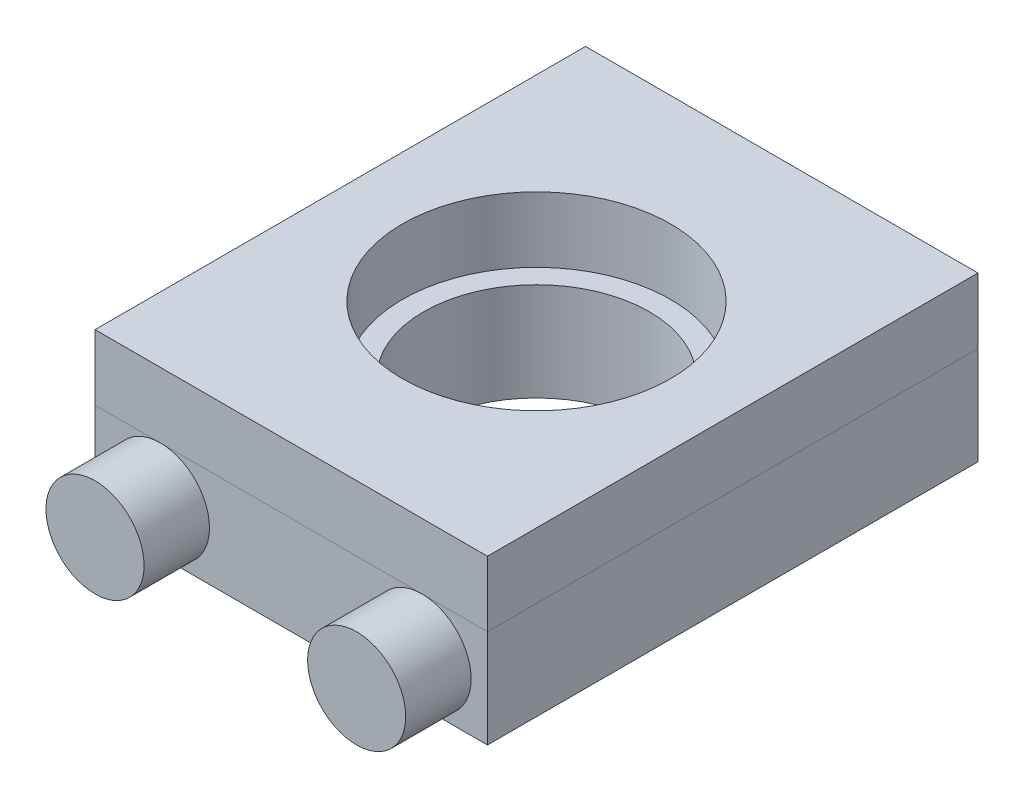
ISO-10303-21;
HEADER;
FILE_DESCRIPTION(('STEP AP214'),'2;1');
FILE_NAME('part.step','',(''),(''),'','','');
FILE_SCHEMA(('AUTOMOTIVE_DESIGN { 1 0 10303 214 1 1 1 1 }'));
ENDSEC;
DATA;
#1=APPLICATION_CONTEXT('core data for automotive mechanical design processes');
#2=APPLICATION_PROTOCOL_DEFINITION('international standard','automotive_design',2000,#1);
#3=PRODUCT_CONTEXT('',#1,'mechanical');
#4=PRODUCT('Part','Part','',(#3));
#5=PRODUCT_RELATED_PRODUCT_CATEGORY('part','',(#4));
#6=PRODUCT_DEFINITION_FORMATION('','',#4);
#7=PRODUCT_DEFINITION_CONTEXT('part definition',#1,'design');
#8=PRODUCT_DEFINITION('design','',#6,#7);
#9=PRODUCT_DEFINITION_SHAPE('','',#8);
#10=(LENGTH_UNIT() NAMED_UNIT(*) SI_UNIT(.MILLI.,.METRE.));
#11=(NAMED_UNIT(*) PLANE_ANGLE_UNIT() SI_UNIT($,.RADIAN.));
#12=(NAMED_UNIT(*) SI_UNIT($,.STERADIAN.) SOLID_ANGLE_UNIT());
#13=UNCERTAINTY_MEASURE_WITH_UNIT(LENGTH_MEASURE(1.E-05),#10,'distance_accuracy_value','');
#14=(GEOMETRIC_REPRESENTATION_CONTEXT(3) GLOBAL_UNCERTAINTY_ASSIGNED_CONTEXT((#13)) GLOBAL_UNIT_ASSIGNED_CONTEXT((#10,
#11,#12)) REPRESENTATION_CONTEXT('',''));
#15=CARTESIAN_POINT('',(0.,0.,0.));
#16=DIRECTION('',(0.,0.,1.));
#17=DIRECTION('',(1.,0.,0.));
#18=AXIS2_PLACEMENT_3D('',#15,#16,#17);
#19=CARTESIAN_POINT('',(12.,5.,0.));
#20=DIRECTION('',(-1.,0.,0.));
#21=DIRECTION('',(0.,0.,1.));
#22=AXIS2_PLACEMENT_3D('',#19,#20,#21);
#23=PLANE('',#22);
#24=DIRECTION('',(0.,0.,-1.));
#25=VECTOR('',#24,1.);
#26=CARTESIAN_POINT('',(12.,3.,0.));
#27=LINE('',#26,#25);
#28=CARTESIAN_POINT('',(12.,3.,0.));
#29=VERTEX_POINT('',#28);
#30=CARTESIAN_POINT('',(12.,3.,-15.));
#31=VERTEX_POINT('',#30);
#32=EDGE_CURVE('E139',#29,#31,#27,.T.);
#33=ORIENTED_EDGE('',*,*,#32,.T.);
#34=DIRECTION('',(0.,-1.,0.));
#35=VECTOR('',#34,1.);
#36=CARTESIAN_POINT('',(12.,5.,-15.));
#37=LINE('',#36,#35);
#38=CARTESIAN_POINT('',(12.,5.,-15.));
#39=VERTEX_POINT('',#38);
#40=EDGE_CURVE('E13',#39,#31,#37,.T.);
#41=ORIENTED_EDGE('',*,*,#40,.F.);
#42=DIRECTION('',(0.,0.,-1.));
#43=VECTOR('',#42,1.);
#44=CARTESIAN_POINT('',(12.,5.,0.));
#45=LINE('',#44,#43);
#46=CARTESIAN_POINT('',(12.,5.,0.));
#47=VERTEX_POINT('',#46);
#48=EDGE_CURVE('E124',#47,#39,#45,.T.);
#49=ORIENTED_EDGE('',*,*,#48,.F.);
#50=DIRECTION('',(0.,-1.,0.));
#51=VECTOR('',#50,1.);
#52=CARTESIAN_POINT('',(12.,5.,0.));
#53=LINE('',#52,#51);
#54=EDGE_CURVE('E132',#47,#29,#53,.T.);
#55=ORIENTED_EDGE('',*,*,#54,.T.);
#56=EDGE_LOOP('',(#33,#41,#49,#55));
#57=FACE_BOUND('',#56,.T.);
#58=ADVANCED_FACE('F72',(#57),#23,.F.);
#59=CARTESIAN_POINT('',(0.,5.,-15.));
#60=DIRECTION('',(0.,0.,1.));
#61=DIRECTION('',(1.,0.,0.));
#62=AXIS2_PLACEMENT_3D('',#59,#60,#61);
#63=PLANE('',#62);
#64=DIRECTION('',(-1.,0.,0.));
#65=VECTOR('',#64,1.);
#66=CARTESIAN_POINT('',(0.,3.,-15.));
#67=LINE('',#66,#65);
#68=CARTESIAN_POINT('',(0.,3.,-15.));
#69=VERTEX_POINT('',#68);
#70=EDGE_CURVE('E128',#31,#69,#67,.T.);
#71=ORIENTED_EDGE('',*,*,#70,.T.);
#72=DIRECTION('',(0.,-1.,0.));
#73=VECTOR('',#72,1.);
#74=CARTESIAN_POINT('',(0.,5.,-15.));
#75=LINE('',#74,#73);
#76=CARTESIAN_POINT('',(0.,5.,-15.));
#77=VERTEX_POINT('',#76);
#78=EDGE_CURVE('E81',#77,#69,#75,.T.);
#79=ORIENTED_EDGE('',*,*,#78,.F.);
#80=DIRECTION('',(-1.,0.,0.));
#81=VECTOR('',#80,1.);
#82=CARTESIAN_POINT('',(0.,5.,-15.));
#83=LINE('',#82,#81);
#84=EDGE_CURVE('E119',#39,#77,#83,.T.);
#85=ORIENTED_EDGE('',*,*,#84,.F.);
#86=ORIENTED_EDGE('',*,*,#40,.T.);
#87=EDGE_LOOP('',(#71,#79,#85,#86));
#88=FACE_BOUND('',#87,.T.);
#89=ADVANCED_FACE('F127',(#88),#63,.F.);
#90=CARTESIAN_POINT('',(0.,5.,0.));
#91=DIRECTION('',(1.,0.,0.));
#92=DIRECTION('',(0.,0.,-1.));
#93=AXIS2_PLACEMENT_3D('',#90,#91,#92);
#94=PLANE('',#93);
#95=DIRECTION('',(0.,0.,1.));
#96=VECTOR('',#95,1.);
#97=CARTESIAN_POINT('',(0.,3.,0.));
#98=LINE('',#97,#96);
#99=CARTESIAN_POINT('',(0.,3.,0.));
#100=VERTEX_POINT('',#99);
#101=EDGE_CURVE('E106',#69,#100,#98,.T.);
#102=ORIENTED_EDGE('',*,*,#101,.T.);
#103=DIRECTION('',(0.,-1.,0.));
#104=VECTOR('',#103,1.);
#105=CARTESIAN_POINT('',(0.,5.,0.));
#106=LINE('',#105,#104);
#107=CARTESIAN_POINT('',(0.,5.,0.));
#108=VERTEX_POINT('',#107);
#109=EDGE_CURVE('E129',#108,#100,#106,.T.);
#110=ORIENTED_EDGE('',*,*,#109,.F.);
#111=DIRECTION('',(0.,0.,1.));
#112=VECTOR('',#111,1.);
#113=CARTESIAN_POINT('',(0.,5.,0.));
#114=LINE('',#113,#112);
#115=EDGE_CURVE('E122',#77,#108,#114,.T.);
#116=ORIENTED_EDGE('',*,*,#115,.F.);
#117=ORIENTED_EDGE('',*,*,#78,.T.);
#118=EDGE_LOOP('',(#102,#110,#116,#117));
#119=FACE_BOUND('',#118,.T.);
#120=ADVANCED_FACE('F130',(#119),#94,.F.);
#121=CARTESIAN_POINT('',(6.,5.,-7.5));
#122=DIRECTION('',(0.,-1.,0.));
#123=DIRECTION('',(0.,0.,-1.));
#124=AXIS2_PLACEMENT_3D('',#121,#122,#123);
#125=CYLINDRICAL_SURFACE('',#124,4.1);
#126=CARTESIAN_POINT('',(6.,5.,-7.5));
#127=DIRECTION('',(0.,1.,0.));
#128=DIRECTION('',(0.,0.,1.));
#129=AXIS2_PLACEMENT_3D('',#126,#127,#128);
#130=CIRCLE('',#129,4.1);
#131=CARTESIAN_POINT('',(6.,5.,-3.4));
#132=VERTEX_POINT('',#131);
#133=EDGE_CURVE('E145',#132,#132,#130,.T.);
#134=ORIENTED_EDGE('',*,*,#133,.T.);
#135=EDGE_LOOP('',(#134));
#136=FACE_BOUND('',#135,.T.);
#137=CARTESIAN_POINT('',(6.,3.,-7.5));
#138=DIRECTION('',(0.,1.,0.));
#139=DIRECTION('',(0.,0.,1.));
#140=AXIS2_PLACEMENT_3D('',#137,#138,#139);
#141=CIRCLE('',#140,4.1);
#142=CARTESIAN_POINT('',(6.,3.,-3.4));
#143=VERTEX_POINT('',#142);
#144=EDGE_CURVE('E136',#143,#143,#141,.T.);
#145=ORIENTED_EDGE('',*,*,#144,.F.);
#146=EDGE_LOOP('',(#145));
#147=FACE_BOUND('',#146,.T.);
#148=ADVANCED_FACE('F74',(#136,#147),#125,.F.);
#149=CARTESIAN_POINT('',(0.,5.,0.));
#150=DIRECTION('',(0.,0.,-1.));
#151=DIRECTION('',(-1.,0.,0.));
#152=AXIS2_PLACEMENT_3D('',#149,#150,#151);
#153=PLANE('',#152);
#154=DIRECTION('',(1.,0.,0.));
#155=VECTOR('',#154,1.);
#156=CARTESIAN_POINT('',(0.,3.,0.));
#157=LINE('',#156,#155);
#158=EDGE_CURVE('E112',#100,#29,#157,.T.);
#159=ORIENTED_EDGE('',*,*,#158,.T.);
#160=ORIENTED_EDGE('',*,*,#54,.F.);
#161=DIRECTION('',(1.,0.,0.));
#162=VECTOR('',#161,1.);
#163=CARTESIAN_POINT('',(0.,5.,0.));
#164=LINE('',#163,#162);
#165=EDGE_CURVE('E89',#108,#47,#164,.T.);
#166=ORIENTED_EDGE('',*,*,#165,.F.);
#167=ORIENTED_EDGE('',*,*,#109,.T.);
#168=EDGE_LOOP('',(#159,#160,#166,#167));
#169=FACE_BOUND('',#168,.T.);
#170=ADVANCED_FACE('F147',(#169),#153,.F.);
#171=CARTESIAN_POINT('',(0.,5.,0.));
#172=DIRECTION('',(0.,1.,0.));
#173=DIRECTION('',(0.,0.,1.));
#174=AXIS2_PLACEMENT_3D('',#171,#172,#173);
#175=PLANE('',#174);
#176=ORIENTED_EDGE('',*,*,#133,.F.);
#177=EDGE_LOOP('',(#176));
#178=FACE_BOUND('',#177,.T.);
#179=ORIENTED_EDGE('',*,*,#48,.T.);
#180=ORIENTED_EDGE('',*,*,#84,.T.);
#181=ORIENTED_EDGE('',*,*,#115,.T.);
#182=ORIENTED_EDGE('',*,*,#165,.T.);
#183=EDGE_LOOP('',(#179,#180,#181,#182));
#184=FACE_BOUND('',#183,.T.);
#185=ADVANCED_FACE('F120',(#178,#184),#175,.T.);
#186=CARTESIAN_POINT('',(0.,3.,0.));
#187=DIRECTION('',(0.,1.,0.));
#188=DIRECTION('',(0.,0.,1.));
#189=AXIS2_PLACEMENT_3D('',#186,#187,#188);
#190=PLANE('',#189);
#191=ORIENTED_EDGE('',*,*,#144,.T.);
#192=EDGE_LOOP('',(#191));
#193=FACE_BOUND('',#192,.T.);
#194=ORIENTED_EDGE('',*,*,#32,.F.);
#195=ORIENTED_EDGE('',*,*,#158,.F.);
#196=ORIENTED_EDGE('',*,*,#101,.F.);
#197=ORIENTED_EDGE('',*,*,#70,.F.);
#198=EDGE_LOOP('',(#194,#195,#196,#197));
#199=FACE_BOUND('',#198,.T.);
#200=ADVANCED_FACE('F150',(#193,#199),#190,.F.);
#201=CLOSED_SHELL('',(#58,#89,#120,#148,#170,#185,#200));
#202=MANIFOLD_SOLID_BREP('B2',#201);
#203=CARTESIAN_POINT('',(0.,3.,0.));
#204=DIRECTION('',(0.,0.,-1.));
#205=DIRECTION('',(-1.,0.,0.));
#206=AXIS2_PLACEMENT_3D('',#203,#204,#205);
#207=PLANE('',#206);
#208=CARTESIAN_POINT('',(2.,1.5,0.));
#209=DIRECTION('',(0.,0.,1.));
#210=DIRECTION('',(1.,0.,0.));
#211=AXIS2_PLACEMENT_3D('',#208,#209,#210);
#212=CIRCLE('',#211,1.5);
#213=CARTESIAN_POINT('',(2.,3.,0.));
#214=VERTEX_POINT('',#213);
#215=CARTESIAN_POINT('',(2.,0.,0.));
#216=VERTEX_POINT('',#215);
#217=EDGE_CURVE('E241',#214,#216,#212,.T.);
#218=ORIENTED_EDGE('',*,*,#217,.F.);
#219=DIRECTION('',(1.,0.,0.));
#220=VECTOR('',#219,1.);
#221=CARTESIAN_POINT('',(0.,3.,0.));
#222=LINE('',#221,#220);
#223=CARTESIAN_POINT('',(0.,3.,0.));
#224=VERTEX_POINT('',#223);
#225=EDGE_CURVE('E339',#224,#214,#222,.T.);
#226=ORIENTED_EDGE('',*,*,#225,.F.);
#227=DIRECTION('',(0.,-1.,0.));
#228=VECTOR('',#227,1.);
#229=CARTESIAN_POINT('',(0.,3.,0.));
#230=LINE('',#229,#228);
#231=CARTESIAN_POINT('',(0.,0.,0.));
#232=VERTEX_POINT('',#231);
#233=EDGE_CURVE('E314',#224,#232,#230,.T.);
#234=ORIENTED_EDGE('',*,*,#233,.T.);
#235=DIRECTION('',(1.,0.,0.));
#236=VECTOR('',#235,1.);
#237=CARTESIAN_POINT('',(0.,0.,0.));
#238=LINE('',#237,#236);
#239=EDGE_CURVE('E287',#232,#216,#238,.T.);
#240=ORIENTED_EDGE('',*,*,#239,.T.);
#241=EDGE_LOOP('',(#218,#226,#234,#240));
#242=FACE_BOUND('',#241,.T.);
#243=ADVANCED_FACE('F229',(#242),#207,.F.);
#244=CARTESIAN_POINT('',(10.,1.5,0.));
#245=DIRECTION('',(0.,0.,1.));
#246=DIRECTION('',(-1.,0.,0.));
#247=AXIS2_PLACEMENT_3D('',#244,#245,#246);
#248=CIRCLE('',#247,1.5);
#249=CARTESIAN_POINT('',(10.,0.,0.));
#250=VERTEX_POINT('',#249);
#251=CARTESIAN_POINT('',(10.,3.,0.));
#252=VERTEX_POINT('',#251);
#253=EDGE_CURVE('E302',#250,#252,#248,.T.);
#254=ORIENTED_EDGE('',*,*,#253,.F.);
#255=CARTESIAN_POINT('',(12.,0.,0.));
#256=VERTEX_POINT('',#255);
#257=EDGE_CURVE('E288',#250,#256,#238,.T.);
#258=ORIENTED_EDGE('',*,*,#257,.T.);
#259=DIRECTION('',(0.,-1.,0.));
#260=VECTOR('',#259,1.);
#261=CARTESIAN_POINT('',(12.,3.,0.));
#262=LINE('',#261,#260);
#263=CARTESIAN_POINT('',(12.,3.,0.));
#264=VERTEX_POINT('',#263);
#265=EDGE_CURVE('E356',#264,#256,#262,.T.);
#266=ORIENTED_EDGE('',*,*,#265,.F.);
#267=EDGE_CURVE('E304',#252,#264,#222,.T.);
#268=ORIENTED_EDGE('',*,*,#267,.F.);
#269=EDGE_LOOP('',(#254,#258,#266,#268));
#270=FACE_BOUND('',#269,.T.);
#271=ADVANCED_FACE('F303',(#270),#207,.F.);
#272=CARTESIAN_POINT('',(0.,3.,0.));
#273=DIRECTION('',(0.,1.,0.));
#274=DIRECTION('',(0.,0.,1.));
#275=AXIS2_PLACEMENT_3D('',#272,#273,#274);
#276=PLANE('',#275);
#277=DIRECTION('',(1.,0.,0.));
#278=VECTOR('',#277,1.);
#279=CARTESIAN_POINT('',(0.,3.,-15.));
#280=LINE('',#279,#278);
#281=CARTESIAN_POINT('',(0.,3.,-15.));
#282=VERTEX_POINT('',#281);
#283=CARTESIAN_POINT('',(12.,3.,-15.));
#284=VERTEX_POINT('',#283);
#285=EDGE_CURVE('E331',#282,#284,#280,.T.);
#286=ORIENTED_EDGE('',*,*,#285,.F.);
#287=DIRECTION('',(0.,0.,-1.));
#288=VECTOR('',#287,1.);
#289=CARTESIAN_POINT('',(0.,3.,0.));
#290=LINE('',#289,#288);
#291=EDGE_CURVE('E342',#224,#282,#290,.T.);
#292=ORIENTED_EDGE('',*,*,#291,.F.);
#293=ORIENTED_EDGE('',*,*,#225,.T.);
#294=EDGE_CURVE('E343',#214,#252,#222,.T.);
#295=ORIENTED_EDGE('',*,*,#294,.T.);
#296=ORIENTED_EDGE('',*,*,#267,.T.);
#297=DIRECTION('',(0.,0.,-1.));
#298=VECTOR('',#297,1.);
#299=CARTESIAN_POINT('',(12.,3.,0.));
#300=LINE('',#299,#298);
#301=EDGE_CURVE('E335',#264,#284,#300,.T.);
#302=ORIENTED_EDGE('',*,*,#301,.T.);
#303=EDGE_LOOP('',(#286,#292,#293,#295,#296,#302));
#304=FACE_BOUND('',#303,.T.);
#305=CARTESIAN_POINT('',(6.,3.,-7.5));
#306=DIRECTION('',(0.,1.,0.));
#307=DIRECTION('',(0.,0.,1.));
#308=AXIS2_PLACEMENT_3D('',#305,#306,#307);
#309=CIRCLE('',#308,3.45);
#310=CARTESIAN_POINT('',(6.,3.,-4.05));
#311=VERTEX_POINT('',#310);
#312=EDGE_CURVE('E321',#311,#311,#309,.T.);
#313=ORIENTED_EDGE('',*,*,#312,.F.);
#314=EDGE_LOOP('',(#313));
#315=FACE_BOUND('',#314,.T.);
#316=ADVANCED_FACE('F372',(#304,#315),#276,.T.);
#317=CARTESIAN_POINT('',(0.,0.,0.));
#318=DIRECTION('',(0.,1.,0.));
#319=DIRECTION('',(0.,0.,1.));
#320=AXIS2_PLACEMENT_3D('',#317,#318,#319);
#321=PLANE('',#320);
#322=DIRECTION('',(1.,0.,0.));
#323=VECTOR('',#322,1.);
#324=CARTESIAN_POINT('',(0.,0.,-15.));
#325=LINE('',#324,#323);
#326=CARTESIAN_POINT('',(0.,0.,-15.));
#327=VERTEX_POINT('',#326);
#328=CARTESIAN_POINT('',(12.,0.,-15.));
#329=VERTEX_POINT('',#328);
#330=EDGE_CURVE('E325',#327,#329,#325,.T.);
#331=ORIENTED_EDGE('',*,*,#330,.T.);
#332=DIRECTION('',(0.,0.,-1.));
#333=VECTOR('',#332,1.);
#334=CARTESIAN_POINT('',(12.,0.,0.));
#335=LINE('',#334,#333);
#336=EDGE_CURVE('E296',#256,#329,#335,.T.);
#337=ORIENTED_EDGE('',*,*,#336,.F.);
#338=ORIENTED_EDGE('',*,*,#257,.F.);
#339=EDGE_CURVE('E280',#216,#250,#238,.T.);
#340=ORIENTED_EDGE('',*,*,#339,.F.);
#341=ORIENTED_EDGE('',*,*,#239,.F.);
#342=DIRECTION('',(0.,0.,-1.));
#343=VECTOR('',#342,1.);
#344=CARTESIAN_POINT('',(0.,0.,0.));
#345=LINE('',#344,#343);
#346=EDGE_CURVE('E336',#232,#327,#345,.T.);
#347=ORIENTED_EDGE('',*,*,#346,.T.);
#348=EDGE_LOOP('',(#331,#337,#338,#340,#341,#347));
#349=FACE_BOUND('',#348,.T.);
#350=CARTESIAN_POINT('',(6.,0.,-7.5));
#351=DIRECTION('',(0.,1.,0.));
#352=DIRECTION('',(0.,0.,1.));
#353=AXIS2_PLACEMENT_3D('',#350,#351,#352);
#354=CIRCLE('',#353,3.45);
#355=CARTESIAN_POINT('',(6.,0.,-4.05));
#356=VERTEX_POINT('',#355);
#357=EDGE_CURVE('E326',#356,#356,#354,.T.);
#358=ORIENTED_EDGE('',*,*,#357,.T.);
#359=EDGE_LOOP('',(#358));
#360=FACE_BOUND('',#359,.T.);
#361=ADVANCED_FACE('F293',(#349,#360),#321,.F.);
#362=CARTESIAN_POINT('',(0.,3.,-15.));
#363=DIRECTION('',(0.,0.,-1.));
#364=DIRECTION('',(-1.,0.,0.));
#365=AXIS2_PLACEMENT_3D('',#362,#363,#364);
#366=PLANE('',#365);
#367=ORIENTED_EDGE('',*,*,#330,.F.);
#368=DIRECTION('',(0.,-1.,0.));
#369=VECTOR('',#368,1.);
#370=CARTESIAN_POINT('',(0.,3.,-15.));
#371=LINE('',#370,#369);
#372=EDGE_CURVE('E312',#282,#327,#371,.T.);
#373=ORIENTED_EDGE('',*,*,#372,.F.);
#374=ORIENTED_EDGE('',*,*,#285,.T.);
#375=DIRECTION('',(0.,-1.,0.));
#376=VECTOR('',#375,1.);
#377=CARTESIAN_POINT('',(12.,3.,-15.));
#378=LINE('',#377,#376);
#379=EDGE_CURVE('E233',#284,#329,#378,.T.);
#380=ORIENTED_EDGE('',*,*,#379,.T.);
#381=EDGE_LOOP('',(#367,#373,#374,#380));
#382=FACE_BOUND('',#381,.T.);
#383=ADVANCED_FACE('F231',(#382),#366,.T.);
#384=CARTESIAN_POINT('',(0.,3.,0.));
#385=DIRECTION('',(-1.,0.,0.));
#386=DIRECTION('',(0.,0.,1.));
#387=AXIS2_PLACEMENT_3D('',#384,#385,#386);
#388=PLANE('',#387);
#389=ORIENTED_EDGE('',*,*,#346,.F.);
#390=ORIENTED_EDGE('',*,*,#233,.F.);
#391=ORIENTED_EDGE('',*,*,#291,.T.);
#392=ORIENTED_EDGE('',*,*,#372,.T.);
#393=EDGE_LOOP('',(#389,#390,#391,#392));
#394=FACE_BOUND('',#393,.T.);
#395=ADVANCED_FACE('F368',(#394),#388,.T.);
#396=EDGE_CURVE('E70',#216,#214,#212,.T.);
#397=ORIENTED_EDGE('',*,*,#396,.F.);
#398=ORIENTED_EDGE('',*,*,#339,.T.);
#399=EDGE_CURVE('E239',#252,#250,#248,.T.);
#400=ORIENTED_EDGE('',*,*,#399,.F.);
#401=ORIENTED_EDGE('',*,*,#294,.F.);
#402=EDGE_LOOP('',(#397,#398,#400,#401));
#403=FACE_BOUND('',#402,.T.);
#404=ADVANCED_FACE('F282',(#403),#207,.F.);
#405=CARTESIAN_POINT('',(12.,3.,0.));
#406=DIRECTION('',(-1.,0.,0.));
#407=DIRECTION('',(0.,0.,1.));
#408=AXIS2_PLACEMENT_3D('',#405,#406,#407);
#409=PLANE('',#408);
#410=ORIENTED_EDGE('',*,*,#336,.T.);
#411=ORIENTED_EDGE('',*,*,#379,.F.);
#412=ORIENTED_EDGE('',*,*,#301,.F.);
#413=ORIENTED_EDGE('',*,*,#265,.T.);
#414=EDGE_LOOP('',(#410,#411,#412,#413));
#415=FACE_BOUND('',#414,.T.);
#416=ADVANCED_FACE('F365',(#415),#409,.F.);
#417=CARTESIAN_POINT('',(6.,3.,-7.5));
#418=DIRECTION('',(0.,-1.,0.));
#419=DIRECTION('',(0.,0.,-1.));
#420=AXIS2_PLACEMENT_3D('',#417,#418,#419);
#421=CYLINDRICAL_SURFACE('',#420,3.45);
#422=ORIENTED_EDGE('',*,*,#312,.T.);
#423=EDGE_LOOP('',(#422));
#424=FACE_BOUND('',#423,.T.);
#425=ORIENTED_EDGE('',*,*,#357,.F.);
#426=EDGE_LOOP('',(#425));
#427=FACE_BOUND('',#426,.T.);
#428=ADVANCED_FACE('F397',(#424,#427),#421,.F.);
#429=CARTESIAN_POINT('',(10.,1.5,2.));
#430=DIRECTION('',(0.,0.,-1.));
#431=DIRECTION('',(-1.,0.,0.));
#432=AXIS2_PLACEMENT_3D('',#429,#430,#431);
#433=CYLINDRICAL_SURFACE('',#432,1.5);
#434=CARTESIAN_POINT('',(10.,1.5,2.));
#435=DIRECTION('',(0.,0.,1.));
#436=DIRECTION('',(-1.,0.,0.));
#437=AXIS2_PLACEMENT_3D('',#434,#435,#436);
#438=CIRCLE('',#437,1.5);
#439=CARTESIAN_POINT('',(8.5,1.5,2.));
#440=VERTEX_POINT('',#439);
#441=EDGE_CURVE('E308',#440,#440,#438,.T.);
#442=ORIENTED_EDGE('',*,*,#441,.F.);
#443=EDGE_LOOP('',(#442));
#444=FACE_BOUND('',#443,.T.);
#445=ORIENTED_EDGE('',*,*,#253,.T.);
#446=ORIENTED_EDGE('',*,*,#399,.T.);
#447=EDGE_LOOP('',(#445,#446));
#448=FACE_BOUND('',#447,.T.);
#449=ADVANCED_FACE('F310',(#444,#448),#433,.T.);
#450=CARTESIAN_POINT('',(10.,1.5,2.));
#451=DIRECTION('',(0.,0.,-1.));
#452=DIRECTION('',(-1.,0.,0.));
#453=AXIS2_PLACEMENT_3D('',#450,#451,#452);
#454=PLANE('',#453);
#455=ORIENTED_EDGE('',*,*,#441,.T.);
#456=EDGE_LOOP('',(#455));
#457=FACE_BOUND('',#456,.T.);
#458=ADVANCED_FACE('F408',(#457),#454,.F.);
#459=CARTESIAN_POINT('',(2.,1.5,2.));
#460=DIRECTION('',(0.,0.,-1.));
#461=DIRECTION('',(-1.,0.,0.));
#462=AXIS2_PLACEMENT_3D('',#459,#460,#461);
#463=CYLINDRICAL_SURFACE('',#462,1.5);
#464=CARTESIAN_POINT('',(2.,1.5,2.));
#465=DIRECTION('',(0.,0.,1.));
#466=DIRECTION('',(1.,0.,0.));
#467=AXIS2_PLACEMENT_3D('',#464,#465,#466);
#468=CIRCLE('',#467,1.5);
#469=CARTESIAN_POINT('',(3.5,1.5,2.));
#470=VERTEX_POINT('',#469);
#471=EDGE_CURVE('E330',#470,#470,#468,.T.);
#472=ORIENTED_EDGE('',*,*,#471,.F.);
#473=EDGE_LOOP('',(#472));
#474=FACE_BOUND('',#473,.T.);
#475=ORIENTED_EDGE('',*,*,#217,.T.);
#476=ORIENTED_EDGE('',*,*,#396,.T.);
#477=EDGE_LOOP('',(#475,#476));
#478=FACE_BOUND('',#477,.T.);
#479=ADVANCED_FACE('F382',(#474,#478),#463,.T.);
#480=CARTESIAN_POINT('',(2.,1.5,2.));
#481=DIRECTION('',(0.,0.,1.));
#482=DIRECTION('',(1.,0.,0.));
#483=AXIS2_PLACEMENT_3D('',#480,#481,#482);
#484=PLANE('',#483);
#485=ORIENTED_EDGE('',*,*,#471,.T.);
#486=EDGE_LOOP('',(#485));
#487=FACE_BOUND('',#486,.T.);
#488=ADVANCED_FACE('F416',(#487),#484,.T.);
#489=CLOSED_SHELL('',(#243,#271,#316,#361,#383,#395,#404,#416,#428,#449,#458,#479,#488));
#490=MANIFOLD_SOLID_BREP('B7',#489);
#491=ADVANCED_BREP_SHAPE_REPRESENTATION('',(#18,#202,#490),#14);
#492=SHAPE_DEFINITION_REPRESENTATION(#9,#491);
ENDSEC;
END-ISO-10303-21;
